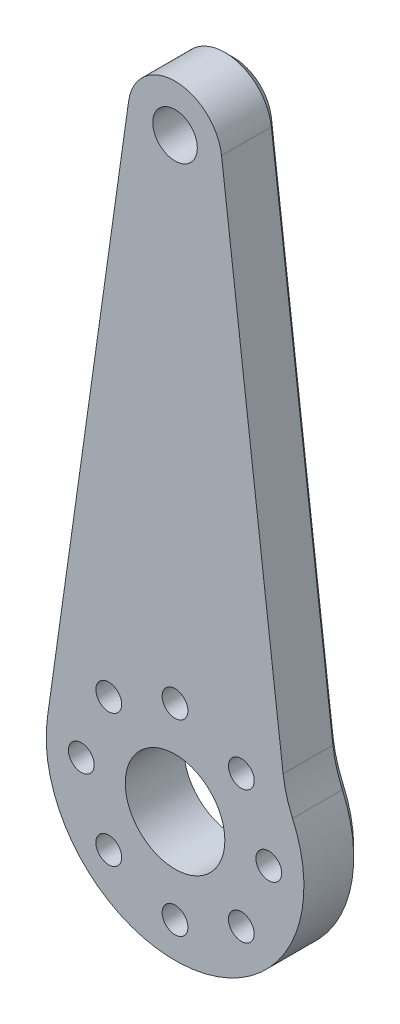
ISO-10303-21;
HEADER;
FILE_DESCRIPTION(('STEP AP214'),'2;1');
FILE_NAME('part.step','',(''),(''),'','','');
FILE_SCHEMA(('AUTOMOTIVE_DESIGN { 1 0 10303 214 1 1 1 1 }'));
ENDSEC;
DATA;
#1=APPLICATION_CONTEXT('core data for automotive mechanical design processes');
#2=APPLICATION_PROTOCOL_DEFINITION('international standard','automotive_design',2000,#1);
#3=PRODUCT_CONTEXT('',#1,'mechanical');
#4=PRODUCT('Part','Part','',(#3));
#5=PRODUCT_RELATED_PRODUCT_CATEGORY('part','',(#4));
#6=PRODUCT_DEFINITION_FORMATION('','',#4);
#7=PRODUCT_DEFINITION_CONTEXT('part definition',#1,'design');
#8=PRODUCT_DEFINITION('design','',#6,#7);
#9=PRODUCT_DEFINITION_SHAPE('','',#8);
#10=(LENGTH_UNIT() NAMED_UNIT(*) SI_UNIT(.MILLI.,.METRE.));
#11=(NAMED_UNIT(*) PLANE_ANGLE_UNIT() SI_UNIT($,.RADIAN.));
#12=(NAMED_UNIT(*) SI_UNIT($,.STERADIAN.) SOLID_ANGLE_UNIT());
#13=UNCERTAINTY_MEASURE_WITH_UNIT(LENGTH_MEASURE(1.E-05),#10,'distance_accuracy_value','');
#14=(GEOMETRIC_REPRESENTATION_CONTEXT(3) GLOBAL_UNCERTAINTY_ASSIGNED_CONTEXT((#13)) GLOBAL_UNIT_ASSIGNED_CONTEXT((#10,
#11,#12)) REPRESENTATION_CONTEXT('',''));
#15=CARTESIAN_POINT('',(0.,0.,0.));
#16=DIRECTION('',(0.,0.,1.));
#17=DIRECTION('',(1.,0.,0.));
#18=AXIS2_PLACEMENT_3D('',#15,#16,#17);
#19=CARTESIAN_POINT('',(-7.04977781571719,-19.9639036018759,5.));
#20=DIRECTION('',(0.,0.,-1.));
#21=DIRECTION('',(-1.,0.,0.));
#22=AXIS2_PLACEMENT_3D('',#19,#20,#21);
#23=CYLINDRICAL_SURFACE('',#22,1.1);
#24=CARTESIAN_POINT('',(-7.04977781571719,-19.9639036018759,5.));
#25=DIRECTION('',(0.,0.,1.));
#26=DIRECTION('',(1.,0.,0.));
#27=AXIS2_PLACEMENT_3D('',#24,#25,#26);
#28=CIRCLE('',#27,1.1);
#29=CARTESIAN_POINT('',(-5.94977781571719,-19.9639036018759,5.));
#30=VERTEX_POINT('',#29);
#31=EDGE_CURVE('E196',#30,#30,#28,.T.);
#32=ORIENTED_EDGE('',*,*,#31,.T.);
#33=EDGE_LOOP('',(#32));
#34=FACE_BOUND('',#33,.T.);
#35=CARTESIAN_POINT('',(-7.04977781571719,-19.9639036018759,2.25));
#36=DIRECTION('',(0.,0.,-1.));
#37=DIRECTION('',(-1.,0.,0.));
#38=AXIS2_PLACEMENT_3D('',#35,#36,#37);
#39=CIRCLE('',#38,1.1);
#40=CARTESIAN_POINT('',(-8.14977781571719,-19.9639036018759,2.25));
#41=VERTEX_POINT('',#40);
#42=EDGE_CURVE('E178',#41,#41,#39,.T.);
#43=ORIENTED_EDGE('',*,*,#42,.T.);
#44=EDGE_LOOP('',(#43));
#45=FACE_BOUND('',#44,.T.);
#46=ADVANCED_FACE('F35',(#34,#45),#23,.F.);
#47=CARTESIAN_POINT('',(-9.39292356622481,-25.6207578513683,5.));
#48=DIRECTION('',(0.,0.,-1.));
#49=DIRECTION('',(-1.,0.,0.));
#50=AXIS2_PLACEMENT_3D('',#47,#48,#49);
#51=CYLINDRICAL_SURFACE('',#50,1.1);
#52=CARTESIAN_POINT('',(-9.39292356622481,-25.6207578513683,5.));
#53=DIRECTION('',(0.,0.,1.));
#54=DIRECTION('',(1.,0.,0.));
#55=AXIS2_PLACEMENT_3D('',#52,#53,#54);
#56=CIRCLE('',#55,1.1);
#57=CARTESIAN_POINT('',(-8.29292356622481,-25.6207578513683,5.));
#58=VERTEX_POINT('',#57);
#59=EDGE_CURVE('E193',#58,#58,#56,.T.);
#60=ORIENTED_EDGE('',*,*,#59,.T.);
#61=EDGE_LOOP('',(#60));
#62=FACE_BOUND('',#61,.T.);
#63=CARTESIAN_POINT('',(-9.39292356622481,-25.6207578513683,2.25));
#64=DIRECTION('',(0.,0.,-1.));
#65=DIRECTION('',(-1.,0.,0.));
#66=AXIS2_PLACEMENT_3D('',#63,#64,#65);
#67=CIRCLE('',#66,1.1);
#68=CARTESIAN_POINT('',(-10.4929235662248,-25.6207578513683,2.25));
#69=VERTEX_POINT('',#68);
#70=EDGE_CURVE('E234',#69,#69,#67,.T.);
#71=ORIENTED_EDGE('',*,*,#70,.T.);
#72=EDGE_LOOP('',(#71));
#73=FACE_BOUND('',#72,.T.);
#74=ADVANCED_FACE('F337',(#62,#73),#51,.F.);
#75=CARTESIAN_POINT('',(-15.0497778157172,-27.9639036018759,5.));
#76=DIRECTION('',(0.,0.,-1.));
#77=DIRECTION('',(-1.,0.,0.));
#78=AXIS2_PLACEMENT_3D('',#75,#76,#77);
#79=CYLINDRICAL_SURFACE('',#78,1.1);
#80=CARTESIAN_POINT('',(-15.0497778157172,-27.9639036018759,5.));
#81=DIRECTION('',(0.,0.,1.));
#82=DIRECTION('',(1.,0.,0.));
#83=AXIS2_PLACEMENT_3D('',#80,#81,#82);
#84=CIRCLE('',#83,1.1);
#85=CARTESIAN_POINT('',(-13.9497778157172,-27.9639036018759,5.));
#86=VERTEX_POINT('',#85);
#87=EDGE_CURVE('E190',#86,#86,#84,.T.);
#88=ORIENTED_EDGE('',*,*,#87,.T.);
#89=EDGE_LOOP('',(#88));
#90=FACE_BOUND('',#89,.T.);
#91=CARTESIAN_POINT('',(-15.0497778157172,-27.9639036018759,2.25));
#92=DIRECTION('',(0.,0.,-1.));
#93=DIRECTION('',(-1.,0.,0.));
#94=AXIS2_PLACEMENT_3D('',#91,#92,#93);
#95=CIRCLE('',#94,1.1);
#96=CARTESIAN_POINT('',(-16.1497778157172,-27.9639036018759,2.25));
#97=VERTEX_POINT('',#96);
#98=EDGE_CURVE('E231',#97,#97,#95,.T.);
#99=ORIENTED_EDGE('',*,*,#98,.T.);
#100=EDGE_LOOP('',(#99));
#101=FACE_BOUND('',#100,.T.);
#102=ADVANCED_FACE('F342',(#90,#101),#79,.F.);
#103=CARTESIAN_POINT('',(-20.7066320652096,-25.6207578513683,5.));
#104=DIRECTION('',(0.,0.,-1.));
#105=DIRECTION('',(-1.,0.,0.));
#106=AXIS2_PLACEMENT_3D('',#103,#104,#105);
#107=CYLINDRICAL_SURFACE('',#106,1.1);
#108=CARTESIAN_POINT('',(-20.7066320652096,-25.6207578513683,5.));
#109=DIRECTION('',(0.,0.,1.));
#110=DIRECTION('',(1.,0.,0.));
#111=AXIS2_PLACEMENT_3D('',#108,#109,#110);
#112=CIRCLE('',#111,1.1);
#113=CARTESIAN_POINT('',(-19.6066320652096,-25.6207578513683,5.));
#114=VERTEX_POINT('',#113);
#115=EDGE_CURVE('E187',#114,#114,#112,.T.);
#116=ORIENTED_EDGE('',*,*,#115,.T.);
#117=EDGE_LOOP('',(#116));
#118=FACE_BOUND('',#117,.T.);
#119=CARTESIAN_POINT('',(-20.7066320652096,-25.6207578513683,2.25));
#120=DIRECTION('',(0.,0.,-1.));
#121=DIRECTION('',(-1.,0.,0.));
#122=AXIS2_PLACEMENT_3D('',#119,#120,#121);
#123=CIRCLE('',#122,1.1);
#124=CARTESIAN_POINT('',(-21.8066320652096,-25.6207578513683,2.25));
#125=VERTEX_POINT('',#124);
#126=EDGE_CURVE('E228',#125,#125,#123,.T.);
#127=ORIENTED_EDGE('',*,*,#126,.T.);
#128=EDGE_LOOP('',(#127));
#129=FACE_BOUND('',#128,.T.);
#130=ADVANCED_FACE('F349',(#118,#129),#107,.F.);
#131=CARTESIAN_POINT('',(-23.0497778157172,-19.9639036018759,5.));
#132=DIRECTION('',(0.,0.,-1.));
#133=DIRECTION('',(-1.,0.,0.));
#134=AXIS2_PLACEMENT_3D('',#131,#132,#133);
#135=CYLINDRICAL_SURFACE('',#134,1.1);
#136=CARTESIAN_POINT('',(-23.0497778157172,-19.9639036018759,5.));
#137=DIRECTION('',(0.,0.,1.));
#138=DIRECTION('',(1.,0.,0.));
#139=AXIS2_PLACEMENT_3D('',#136,#137,#138);
#140=CIRCLE('',#139,1.1);
#141=CARTESIAN_POINT('',(-21.9497778157172,-19.9639036018759,5.));
#142=VERTEX_POINT('',#141);
#143=EDGE_CURVE('E184',#142,#142,#140,.T.);
#144=ORIENTED_EDGE('',*,*,#143,.T.);
#145=EDGE_LOOP('',(#144));
#146=FACE_BOUND('',#145,.T.);
#147=CARTESIAN_POINT('',(-23.0497778157172,-19.9639036018759,2.25));
#148=DIRECTION('',(0.,0.,-1.));
#149=DIRECTION('',(-1.,0.,0.));
#150=AXIS2_PLACEMENT_3D('',#147,#148,#149);
#151=CIRCLE('',#150,1.1);
#152=CARTESIAN_POINT('',(-24.1497778157172,-19.9639036018759,2.25));
#153=VERTEX_POINT('',#152);
#154=EDGE_CURVE('E225',#153,#153,#151,.T.);
#155=ORIENTED_EDGE('',*,*,#154,.T.);
#156=EDGE_LOOP('',(#155));
#157=FACE_BOUND('',#156,.T.);
#158=ADVANCED_FACE('F353',(#146,#157),#135,.F.);
#159=CARTESIAN_POINT('',(-20.7066320652096,-14.3070493523836,5.));
#160=DIRECTION('',(0.,0.,-1.));
#161=DIRECTION('',(-1.,0.,0.));
#162=AXIS2_PLACEMENT_3D('',#159,#160,#161);
#163=CYLINDRICAL_SURFACE('',#162,1.1);
#164=CARTESIAN_POINT('',(-20.7066320652096,-14.3070493523836,5.));
#165=DIRECTION('',(0.,0.,1.));
#166=DIRECTION('',(1.,0.,0.));
#167=AXIS2_PLACEMENT_3D('',#164,#165,#166);
#168=CIRCLE('',#167,1.1);
#169=CARTESIAN_POINT('',(-19.6066320652096,-14.3070493523836,5.));
#170=VERTEX_POINT('',#169);
#171=EDGE_CURVE('E181',#170,#170,#168,.T.);
#172=ORIENTED_EDGE('',*,*,#171,.T.);
#173=EDGE_LOOP('',(#172));
#174=FACE_BOUND('',#173,.T.);
#175=CARTESIAN_POINT('',(-20.7066320652096,-14.3070493523836,2.25));
#176=DIRECTION('',(0.,0.,-1.));
#177=DIRECTION('',(-1.,0.,0.));
#178=AXIS2_PLACEMENT_3D('',#175,#176,#177);
#179=CIRCLE('',#178,1.1);
#180=CARTESIAN_POINT('',(-21.8066320652096,-14.3070493523836,2.25));
#181=VERTEX_POINT('',#180);
#182=EDGE_CURVE('E222',#181,#181,#179,.T.);
#183=ORIENTED_EDGE('',*,*,#182,.T.);
#184=EDGE_LOOP('',(#183));
#185=FACE_BOUND('',#184,.T.);
#186=ADVANCED_FACE('F357',(#174,#185),#163,.F.);
#187=CARTESIAN_POINT('',(-15.0497778157172,-11.9639036018759,5.));
#188=DIRECTION('',(0.,0.,-1.));
#189=DIRECTION('',(-1.,0.,0.));
#190=AXIS2_PLACEMENT_3D('',#187,#188,#189);
#191=CYLINDRICAL_SURFACE('',#190,1.1);
#192=CARTESIAN_POINT('',(-15.0497778157172,-11.9639036018759,5.));
#193=DIRECTION('',(0.,0.,1.));
#194=DIRECTION('',(1.,0.,0.));
#195=AXIS2_PLACEMENT_3D('',#192,#193,#194);
#196=CIRCLE('',#195,1.1);
#197=CARTESIAN_POINT('',(-13.9497778157172,-11.9639036018759,5.));
#198=VERTEX_POINT('',#197);
#199=EDGE_CURVE('E177',#198,#198,#196,.T.);
#200=ORIENTED_EDGE('',*,*,#199,.T.);
#201=EDGE_LOOP('',(#200));
#202=FACE_BOUND('',#201,.T.);
#203=CARTESIAN_POINT('',(-15.0497778157172,-11.9639036018759,2.25));
#204=DIRECTION('',(0.,0.,-1.));
#205=DIRECTION('',(-1.,0.,0.));
#206=AXIS2_PLACEMENT_3D('',#203,#204,#205);
#207=CIRCLE('',#206,1.1);
#208=CARTESIAN_POINT('',(-16.1497778157172,-11.9639036018759,2.25));
#209=VERTEX_POINT('',#208);
#210=EDGE_CURVE('E219',#209,#209,#207,.T.);
#211=ORIENTED_EDGE('',*,*,#210,.T.);
#212=EDGE_LOOP('',(#211));
#213=FACE_BOUND('',#212,.T.);
#214=ADVANCED_FACE('F361',(#202,#213),#191,.F.);
#215=CARTESIAN_POINT('',(-9.39292356622481,-14.3070493523836,5.));
#216=DIRECTION('',(0.,0.,-1.));
#217=DIRECTION('',(-1.,0.,0.));
#218=AXIS2_PLACEMENT_3D('',#215,#216,#217);
#219=CYLINDRICAL_SURFACE('',#218,1.1);
#220=CARTESIAN_POINT('',(-9.39292356622481,-14.3070493523836,5.));
#221=DIRECTION('',(0.,0.,1.));
#222=DIRECTION('',(1.,0.,0.));
#223=AXIS2_PLACEMENT_3D('',#220,#221,#222);
#224=CIRCLE('',#223,1.1);
#225=CARTESIAN_POINT('',(-8.29292356622481,-14.3070493523836,5.));
#226=VERTEX_POINT('',#225);
#227=EDGE_CURVE('E174',#226,#226,#224,.T.);
#228=ORIENTED_EDGE('',*,*,#227,.T.);
#229=EDGE_LOOP('',(#228));
#230=FACE_BOUND('',#229,.T.);
#231=CARTESIAN_POINT('',(-9.39292356622481,-14.3070493523836,2.25));
#232=DIRECTION('',(0.,0.,-1.));
#233=DIRECTION('',(-1.,0.,0.));
#234=AXIS2_PLACEMENT_3D('',#231,#232,#233);
#235=CIRCLE('',#234,1.1);
#236=CARTESIAN_POINT('',(-10.4929235662248,-14.3070493523836,2.25));
#237=VERTEX_POINT('',#236);
#238=EDGE_CURVE('E171',#237,#237,#235,.T.);
#239=ORIENTED_EDGE('',*,*,#238,.T.);
#240=EDGE_LOOP('',(#239));
#241=FACE_BOUND('',#240,.T.);
#242=ADVANCED_FACE('F365',(#230,#241),#219,.F.);
#243=CARTESIAN_POINT('',(-15.0497778157172,30.0360963981241,5.));
#244=DIRECTION('',(0.,0.,1.));
#245=DIRECTION('',(1.,0.,0.));
#246=AXIS2_PLACEMENT_3D('',#243,#244,#245);
#247=PLANE('',#246);
#248=DIRECTION('',(0.121040450977477,-0.992647575540871,0.));
#249=VECTOR('',#248,1.);
#250=CARTESIAN_POINT('',(-11.0791875135537,30.520258202034,5.));
#251=LINE('',#250,#249);
#252=CARTESIAN_POINT('',(-11.0791875135537,30.520258202034,5.));
#253=VERTEX_POINT('',#252);
#254=CARTESIAN_POINT('',(-5.8267486952866,-12.5547685061841,5.));
#255=VERTEX_POINT('',#254);
#256=EDGE_CURVE('E113',#253,#255,#251,.T.);
#257=ORIENTED_EDGE('',*,*,#256,.F.);
#258=CARTESIAN_POINT('',(-15.0497778157172,30.0360963981241,5.));
#259=DIRECTION('',(0.,0.,1.));
#260=DIRECTION('',(1.,0.,0.));
#261=AXIS2_PLACEMENT_3D('',#258,#259,#260);
#262=CIRCLE('',#261,4.);
#263=CARTESIAN_POINT('',(-19.0103838299529,30.5960963981241,5.));
#264=VERTEX_POINT('',#263);
#265=EDGE_CURVE('E98',#253,#264,#262,.T.);
#266=ORIENTED_EDGE('',*,*,#265,.T.);
#267=DIRECTION('',(-0.14,-0.990151503558925,0.));
#268=VECTOR('',#267,1.);
#269=CARTESIAN_POINT('',(-19.0103838299529,30.5960963981241,5.));
#270=LINE('',#269,#268);
#271=CARTESIAN_POINT('',(-25.9414443548654,-18.4239036018759,5.));
#272=VERTEX_POINT('',#271);
#273=EDGE_CURVE('E105',#264,#272,#270,.T.);
#274=ORIENTED_EDGE('',*,*,#273,.T.);
#275=CARTESIAN_POINT('',(-15.0497778157172,-19.9639036018759,5.));
#276=DIRECTION('',(0.,0.,1.));
#277=DIRECTION('',(1.,0.,0.));
#278=AXIS2_PLACEMENT_3D('',#275,#276,#277);
#279=CIRCLE('',#278,11.);
#280=CARTESIAN_POINT('',(-5.01908478551565,-15.4489066656792,5.));
#281=VERTEX_POINT('',#280);
#282=EDGE_CURVE('E211',#272,#281,#279,.T.);
#283=ORIENTED_EDGE('',*,*,#282,.T.);
#284=CARTESIAN_POINT('',(4.09972706012211,-11.3443639964094,5.));
#285=DIRECTION('',(0.,0.,1.));
#286=DIRECTION('',(1.,0.,0.));
#287=AXIS2_PLACEMENT_3D('',#284,#285,#286);
#288=CIRCLE('',#287,10.);
#289=EDGE_CURVE('E122',#281,#255,#288,.F.);
#290=ORIENTED_EDGE('',*,*,#289,.T.);
#291=EDGE_LOOP('',(#257,#266,#274,#283,#290));
#292=FACE_BOUND('',#291,.T.);
#293=ORIENTED_EDGE('',*,*,#199,.F.);
#294=EDGE_LOOP('',(#293));
#295=FACE_BOUND('',#294,.T.);
#296=ORIENTED_EDGE('',*,*,#143,.F.);
#297=EDGE_LOOP('',(#296));
#298=FACE_BOUND('',#297,.T.);
#299=ORIENTED_EDGE('',*,*,#87,.F.);
#300=EDGE_LOOP('',(#299));
#301=FACE_BOUND('',#300,.T.);
#302=ORIENTED_EDGE('',*,*,#31,.F.);
#303=EDGE_LOOP('',(#302));
#304=FACE_BOUND('',#303,.T.);
#305=CARTESIAN_POINT('',(-15.0497778157172,30.0360963981241,5.));
#306=DIRECTION('',(0.,0.,1.));
#307=DIRECTION('',(1.,0.,0.));
#308=AXIS2_PLACEMENT_3D('',#305,#306,#307);
#309=CIRCLE('',#308,1.9);
#310=CARTESIAN_POINT('',(-13.1497778157172,30.0360963981241,5.));
#311=VERTEX_POINT('',#310);
#312=EDGE_CURVE('E106',#311,#311,#309,.T.);
#313=ORIENTED_EDGE('',*,*,#312,.F.);
#314=EDGE_LOOP('',(#313));
#315=FACE_BOUND('',#314,.T.);
#316=CARTESIAN_POINT('',(-15.0497778157172,-19.9639036018759,5.));
#317=DIRECTION('',(0.,0.,1.));
#318=DIRECTION('',(1.,0.,0.));
#319=AXIS2_PLACEMENT_3D('',#316,#317,#318);
#320=CIRCLE('',#319,4.25);
#321=CARTESIAN_POINT('',(-10.7997778157172,-19.9639036018759,5.));
#322=VERTEX_POINT('',#321);
#323=EDGE_CURVE('E200',#322,#322,#320,.T.);
#324=ORIENTED_EDGE('',*,*,#323,.F.);
#325=EDGE_LOOP('',(#324));
#326=FACE_BOUND('',#325,.T.);
#327=ORIENTED_EDGE('',*,*,#59,.F.);
#328=EDGE_LOOP('',(#327));
#329=FACE_BOUND('',#328,.T.);
#330=ORIENTED_EDGE('',*,*,#115,.F.);
#331=EDGE_LOOP('',(#330));
#332=FACE_BOUND('',#331,.T.);
#333=ORIENTED_EDGE('',*,*,#171,.F.);
#334=EDGE_LOOP('',(#333));
#335=FACE_BOUND('',#334,.T.);
#336=ORIENTED_EDGE('',*,*,#227,.F.);
#337=EDGE_LOOP('',(#336));
#338=FACE_BOUND('',#337,.T.);
#339=ADVANCED_FACE('F118',(#292,#295,#298,#301,#304,#315,#326,#329,#332,#335,#338),#247,.T.);
#340=CARTESIAN_POINT('',(-15.0497778157172,30.0360963981241,0.));
#341=DIRECTION('',(0.,0.,1.));
#342=DIRECTION('',(1.,0.,0.));
#343=AXIS2_PLACEMENT_3D('',#340,#341,#342);
#344=PLANE('',#343);
#345=CARTESIAN_POINT('',(-15.0497778157172,30.0360963981241,0.));
#346=DIRECTION('',(0.,0.,1.));
#347=DIRECTION('',(1.,0.,0.));
#348=AXIS2_PLACEMENT_3D('',#345,#346,#347);
#349=CIRCLE('',#348,3.25);
#350=CARTESIAN_POINT('',(-18.2677702022837,30.4910963981241,0.));
#351=VERTEX_POINT('',#350);
#352=CARTESIAN_POINT('',(-11.8236731952094,30.4294778638009,0.));
#353=VERTEX_POINT('',#352);
#354=EDGE_CURVE('E248',#351,#353,#349,.F.);
#355=ORIENTED_EDGE('',*,*,#354,.T.);
#356=DIRECTION('',(0.121040450977477,-0.992647575540871,0.));
#357=VECTOR('',#356,1.);
#358=CARTESIAN_POINT('',(-11.8236731952094,30.4294778638009,0.));
#359=LINE('',#358,#357);
#360=CARTESIAN_POINT('',(-6.57123437694225,-12.6455488444172,0.));
#361=VERTEX_POINT('',#360);
#362=EDGE_CURVE('E252',#353,#361,#359,.T.);
#363=ORIENTED_EDGE('',*,*,#362,.T.);
#364=CARTESIAN_POINT('',(4.09972706012211,-11.3443639964094,0.));
#365=DIRECTION('',(0.,0.,1.));
#366=DIRECTION('',(1.,0.,0.));
#367=AXIS2_PLACEMENT_3D('',#364,#365,#366);
#368=CIRCLE('',#367,10.75);
#369=CARTESIAN_POINT('',(-5.70299567393849,-15.7567473658744,0.));
#370=VERTEX_POINT('',#369);
#371=EDGE_CURVE('E250',#361,#370,#368,.T.);
#372=ORIENTED_EDGE('',*,*,#371,.T.);
#373=CARTESIAN_POINT('',(-15.0497778157172,-19.9639036018759,0.));
#374=DIRECTION('',(0.,0.,1.));
#375=DIRECTION('',(1.,0.,0.));
#376=AXIS2_PLACEMENT_3D('',#373,#374,#375);
#377=CIRCLE('',#376,10.25);
#378=CARTESIAN_POINT('',(-25.1988307271962,-18.5289036018759,0.));
#379=VERTEX_POINT('',#378);
#380=EDGE_CURVE('E246',#370,#379,#377,.F.);
#381=ORIENTED_EDGE('',*,*,#380,.T.);
#382=DIRECTION('',(0.14,0.990151503558925,0.));
#383=VECTOR('',#382,1.);
#384=CARTESIAN_POINT('',(-18.2677702022837,30.4910963981241,0.));
#385=LINE('',#384,#383);
#386=EDGE_CURVE('E244',#379,#351,#385,.T.);
#387=ORIENTED_EDGE('',*,*,#386,.T.);
#388=EDGE_LOOP('',(#355,#363,#372,#381,#387));
#389=FACE_BOUND('',#388,.T.);
#390=CARTESIAN_POINT('',(-20.7066320652096,-14.3070493523835,0.));
#391=DIRECTION('',(0.,0.,-1.));
#392=DIRECTION('',(-1.,0.,0.));
#393=AXIS2_PLACEMENT_3D('',#390,#391,#392);
#394=CIRCLE('',#393,1.75);
#395=CARTESIAN_POINT('',(-22.4566320652096,-14.3070493523835,0.));
#396=VERTEX_POINT('',#395);
#397=EDGE_CURVE('E123',#396,#396,#394,.T.);
#398=ORIENTED_EDGE('',*,*,#397,.F.);
#399=EDGE_LOOP('',(#398));
#400=FACE_BOUND('',#399,.T.);
#401=CARTESIAN_POINT('',(-15.0497778157172,-11.9639036018759,0.));
#402=DIRECTION('',(0.,0.,-1.));
#403=DIRECTION('',(-1.,0.,0.));
#404=AXIS2_PLACEMENT_3D('',#401,#402,#403);
#405=CIRCLE('',#404,1.75);
#406=CARTESIAN_POINT('',(-16.7997778157172,-11.9639036018759,0.));
#407=VERTEX_POINT('',#406);
#408=EDGE_CURVE('E163',#407,#407,#405,.T.);
#409=ORIENTED_EDGE('',*,*,#408,.F.);
#410=EDGE_LOOP('',(#409));
#411=FACE_BOUND('',#410,.T.);
#412=CARTESIAN_POINT('',(-9.3929235662248,-14.3070493523836,0.));
#413=DIRECTION('',(0.,0.,-1.));
#414=DIRECTION('',(-1.,0.,0.));
#415=AXIS2_PLACEMENT_3D('',#412,#413,#414);
#416=CIRCLE('',#415,1.75);
#417=CARTESIAN_POINT('',(-11.1429235662248,-14.3070493523836,0.));
#418=VERTEX_POINT('',#417);
#419=EDGE_CURVE('E157',#418,#418,#416,.T.);
#420=ORIENTED_EDGE('',*,*,#419,.F.);
#421=EDGE_LOOP('',(#420));
#422=FACE_BOUND('',#421,.T.);
#423=CARTESIAN_POINT('',(-7.04977781571719,-19.9639036018759,0.));
#424=DIRECTION('',(0.,0.,-1.));
#425=DIRECTION('',(-1.,0.,0.));
#426=AXIS2_PLACEMENT_3D('',#423,#424,#425);
#427=CIRCLE('',#426,1.75);
#428=CARTESIAN_POINT('',(-8.79977781571719,-19.9639036018759,0.));
#429=VERTEX_POINT('',#428);
#430=EDGE_CURVE('E151',#429,#429,#427,.T.);
#431=ORIENTED_EDGE('',*,*,#430,.F.);
#432=EDGE_LOOP('',(#431));
#433=FACE_BOUND('',#432,.T.);
#434=CARTESIAN_POINT('',(-9.39292356622481,-25.6207578513683,0.));
#435=DIRECTION('',(0.,0.,-1.));
#436=DIRECTION('',(-1.,0.,0.));
#437=AXIS2_PLACEMENT_3D('',#434,#435,#436);
#438=CIRCLE('',#437,1.75);
#439=CARTESIAN_POINT('',(-11.1429235662248,-25.6207578513683,0.));
#440=VERTEX_POINT('',#439);
#441=EDGE_CURVE('E145',#440,#440,#438,.T.);
#442=ORIENTED_EDGE('',*,*,#441,.F.);
#443=EDGE_LOOP('',(#442));
#444=FACE_BOUND('',#443,.T.);
#445=CARTESIAN_POINT('',(-15.0497778157172,-27.9639036018759,0.));
#446=DIRECTION('',(0.,0.,-1.));
#447=DIRECTION('',(-1.,0.,0.));
#448=AXIS2_PLACEMENT_3D('',#445,#446,#447);
#449=CIRCLE('',#448,1.75);
#450=CARTESIAN_POINT('',(-16.7997778157172,-27.9639036018759,0.));
#451=VERTEX_POINT('',#450);
#452=EDGE_CURVE('E139',#451,#451,#449,.T.);
#453=ORIENTED_EDGE('',*,*,#452,.F.);
#454=EDGE_LOOP('',(#453));
#455=FACE_BOUND('',#454,.T.);
#456=CARTESIAN_POINT('',(-20.7066320652096,-25.6207578513683,0.));
#457=DIRECTION('',(0.,0.,-1.));
#458=DIRECTION('',(-1.,0.,0.));
#459=AXIS2_PLACEMENT_3D('',#456,#457,#458);
#460=CIRCLE('',#459,1.74999999999999);
#461=CARTESIAN_POINT('',(-22.4566320652096,-25.6207578513683,0.));
#462=VERTEX_POINT('',#461);
#463=EDGE_CURVE('E133',#462,#462,#460,.T.);
#464=ORIENTED_EDGE('',*,*,#463,.F.);
#465=EDGE_LOOP('',(#464));
#466=FACE_BOUND('',#465,.T.);
#467=CARTESIAN_POINT('',(-23.0497778157172,-19.9639036018759,0.));
#468=DIRECTION('',(0.,0.,-1.));
#469=DIRECTION('',(-1.,0.,0.));
#470=AXIS2_PLACEMENT_3D('',#467,#468,#469);
#471=CIRCLE('',#470,1.75);
#472=CARTESIAN_POINT('',(-24.7997778157172,-19.9639036018759,0.));
#473=VERTEX_POINT('',#472);
#474=EDGE_CURVE('E132',#473,#473,#471,.T.);
#475=ORIENTED_EDGE('',*,*,#474,.F.);
#476=EDGE_LOOP('',(#475));
#477=FACE_BOUND('',#476,.T.);
#478=CARTESIAN_POINT('',(-15.0497778157172,30.0360963981241,0.));
#479=DIRECTION('',(0.,0.,1.));
#480=DIRECTION('',(1.,0.,0.));
#481=AXIS2_PLACEMENT_3D('',#478,#479,#480);
#482=CIRCLE('',#481,1.9);
#483=CARTESIAN_POINT('',(-13.1497778157172,30.0360963981241,0.));
#484=VERTEX_POINT('',#483);
#485=EDGE_CURVE('E203',#484,#484,#482,.T.);
#486=ORIENTED_EDGE('',*,*,#485,.T.);
#487=EDGE_LOOP('',(#486));
#488=FACE_BOUND('',#487,.T.);
#489=CARTESIAN_POINT('',(-15.0497778157172,-19.9639036018759,0.));
#490=DIRECTION('',(0.,0.,1.));
#491=DIRECTION('',(1.,0.,0.));
#492=AXIS2_PLACEMENT_3D('',#489,#490,#491);
#493=CIRCLE('',#492,4.25);
#494=CARTESIAN_POINT('',(-10.7997778157172,-19.9639036018759,0.));
#495=VERTEX_POINT('',#494);
#496=EDGE_CURVE('E199',#495,#495,#493,.T.);
#497=ORIENTED_EDGE('',*,*,#496,.T.);
#498=EDGE_LOOP('',(#497));
#499=FACE_BOUND('',#498,.T.);
#500=ADVANCED_FACE('F296',(#389,#400,#411,#422,#433,#444,#455,#466,#477,#488,#499),#344,.F.);
#501=CARTESIAN_POINT('',(-15.0497778157172,30.0360963981241,5.));
#502=DIRECTION('',(0.,0.,-1.));
#503=DIRECTION('',(-1.,0.,0.));
#504=AXIS2_PLACEMENT_3D('',#501,#502,#503);
#505=CYLINDRICAL_SURFACE('',#504,4.);
#506=DIRECTION('',(0.,0.,-1.));
#507=VECTOR('',#506,1.);
#508=CARTESIAN_POINT('',(-11.0791875135537,30.520258202034,10.));
#509=LINE('',#508,#507);
#510=CARTESIAN_POINT('',(-11.0791875135537,30.520258202034,0.749999999999994));
#511=VERTEX_POINT('',#510);
#512=EDGE_CURVE('E101',#253,#511,#509,.T.);
#513=ORIENTED_EDGE('',*,*,#512,.T.);
#514=CARTESIAN_POINT('',(-15.0497778157172,30.0360963981241,0.749999999999994));
#515=DIRECTION('',(0.,0.,1.));
#516=DIRECTION('',(1.,0.,0.));
#517=AXIS2_PLACEMENT_3D('',#514,#515,#516);
#518=CIRCLE('',#517,4.);
#519=CARTESIAN_POINT('',(-19.0103838299529,30.5960963981241,0.749999999999995));
#520=VERTEX_POINT('',#519);
#521=EDGE_CURVE('E58',#511,#520,#518,.T.);
#522=ORIENTED_EDGE('',*,*,#521,.T.);
#523=DIRECTION('',(0.,0.,-1.));
#524=VECTOR('',#523,1.);
#525=CARTESIAN_POINT('',(-19.0103838299529,30.5960963981241,5.));
#526=LINE('',#525,#524);
#527=EDGE_CURVE('E102',#264,#520,#526,.T.);
#528=ORIENTED_EDGE('',*,*,#527,.F.);
#529=ORIENTED_EDGE('',*,*,#265,.F.);
#530=EDGE_LOOP('',(#513,#522,#528,#529));
#531=FACE_BOUND('',#530,.T.);
#532=ADVANCED_FACE('F100',(#531),#505,.T.);
#533=CARTESIAN_POINT('',(-19.0103838299529,30.5960963981241,5.));
#534=DIRECTION('',(0.990151503558925,-0.14,0.));
#535=DIRECTION('',(0.14,0.990151503558925,0.));
#536=AXIS2_PLACEMENT_3D('',#533,#534,#535);
#537=PLANE('',#536);
#538=ORIENTED_EDGE('',*,*,#527,.T.);
#539=DIRECTION('',(-0.14,-0.990151503558925,0.));
#540=VECTOR('',#539,1.);
#541=CARTESIAN_POINT('',(-19.0103838299529,30.5960963981241,0.749999999999995));
#542=LINE('',#541,#540);
#543=CARTESIAN_POINT('',(-25.9414443548654,-18.4239036018759,0.749999999999995));
#544=VERTEX_POINT('',#543);
#545=EDGE_CURVE('E11',#520,#544,#542,.T.);
#546=ORIENTED_EDGE('',*,*,#545,.T.);
#547=DIRECTION('',(0.,0.,-1.));
#548=VECTOR('',#547,1.);
#549=CARTESIAN_POINT('',(-25.9414443548654,-18.4239036018759,5.));
#550=LINE('',#549,#548);
#551=EDGE_CURVE('E213',#272,#544,#550,.T.);
#552=ORIENTED_EDGE('',*,*,#551,.F.);
#553=ORIENTED_EDGE('',*,*,#273,.F.);
#554=EDGE_LOOP('',(#538,#546,#552,#553));
#555=FACE_BOUND('',#554,.T.);
#556=ADVANCED_FACE('F491',(#555),#537,.F.);
#557=CARTESIAN_POINT('',(-15.0497778157172,-19.9639036018759,5.));
#558=DIRECTION('',(0.,0.,-1.));
#559=DIRECTION('',(-1.,0.,0.));
#560=AXIS2_PLACEMENT_3D('',#557,#558,#559);
#561=CYLINDRICAL_SURFACE('',#560,11.);
#562=ORIENTED_EDGE('',*,*,#551,.T.);
#563=CARTESIAN_POINT('',(-15.0497778157172,-19.9639036018759,0.749999999999994));
#564=DIRECTION('',(0.,0.,1.));
#565=DIRECTION('',(1.,0.,0.));
#566=AXIS2_PLACEMENT_3D('',#563,#564,#565);
#567=CIRCLE('',#566,11.);
#568=CARTESIAN_POINT('',(-5.01908478551565,-15.4489066656792,0.749999999999994));
#569=VERTEX_POINT('',#568);
#570=EDGE_CURVE('E44',#544,#569,#567,.T.);
#571=ORIENTED_EDGE('',*,*,#570,.T.);
#572=DIRECTION('',(0.,0.,-1.));
#573=VECTOR('',#572,1.);
#574=CARTESIAN_POINT('',(-5.01908478551565,-15.4489066656792,5.));
#575=LINE('',#574,#573);
#576=EDGE_CURVE('E240',#569,#281,#575,.F.);
#577=ORIENTED_EDGE('',*,*,#576,.T.);
#578=ORIENTED_EDGE('',*,*,#282,.F.);
#579=EDGE_LOOP('',(#562,#571,#577,#578));
#580=FACE_BOUND('',#579,.T.);
#581=ADVANCED_FACE('F282',(#580),#561,.T.);
#582=CARTESIAN_POINT('',(-15.0497778157172,30.0360963981241,5.));
#583=DIRECTION('',(0.,0.,-1.));
#584=DIRECTION('',(-1.,0.,0.));
#585=AXIS2_PLACEMENT_3D('',#582,#583,#584);
#586=CYLINDRICAL_SURFACE('',#585,1.9);
#587=ORIENTED_EDGE('',*,*,#312,.T.);
#588=EDGE_LOOP('',(#587));
#589=FACE_BOUND('',#588,.T.);
#590=ORIENTED_EDGE('',*,*,#485,.F.);
#591=EDGE_LOOP('',(#590));
#592=FACE_BOUND('',#591,.T.);
#593=ADVANCED_FACE('F323',(#589,#592),#586,.F.);
#594=CARTESIAN_POINT('',(-15.0497778157172,-19.9639036018759,5.));
#595=DIRECTION('',(0.,0.,-1.));
#596=DIRECTION('',(-1.,0.,0.));
#597=AXIS2_PLACEMENT_3D('',#594,#595,#596);
#598=CYLINDRICAL_SURFACE('',#597,4.25);
#599=ORIENTED_EDGE('',*,*,#323,.T.);
#600=EDGE_LOOP('',(#599));
#601=FACE_BOUND('',#600,.T.);
#602=ORIENTED_EDGE('',*,*,#496,.F.);
#603=EDGE_LOOP('',(#602));
#604=FACE_BOUND('',#603,.T.);
#605=ADVANCED_FACE('F320',(#601,#604),#598,.F.);
#606=CARTESIAN_POINT('',(-9.3929235662248,-14.3070493523836,2.25));
#607=DIRECTION('',(0.,0.,-1.));
#608=DIRECTION('',(-1.,0.,0.));
#609=AXIS2_PLACEMENT_3D('',#606,#607,#608);
#610=CYLINDRICAL_SURFACE('',#609,1.75);
#611=CARTESIAN_POINT('',(-9.3929235662248,-14.3070493523836,2.25));
#612=DIRECTION('',(0.,0.,-1.));
#613=DIRECTION('',(-1.,0.,0.));
#614=AXIS2_PLACEMENT_3D('',#611,#612,#613);
#615=CIRCLE('',#614,1.75);
#616=CARTESIAN_POINT('',(-11.1429235662248,-14.3070493523836,2.25));
#617=VERTEX_POINT('',#616);
#618=EDGE_CURVE('E154',#617,#617,#615,.T.);
#619=ORIENTED_EDGE('',*,*,#618,.F.);
#620=EDGE_LOOP('',(#619));
#621=FACE_BOUND('',#620,.T.);
#622=ORIENTED_EDGE('',*,*,#419,.T.);
#623=EDGE_LOOP('',(#622));
#624=FACE_BOUND('',#623,.T.);
#625=ADVANCED_FACE('F322',(#621,#624),#610,.F.);
#626=CARTESIAN_POINT('',(-9.3929235662248,-14.3070493523836,2.25));
#627=DIRECTION('',(0.,0.,-1.));
#628=DIRECTION('',(-1.,0.,0.));
#629=AXIS2_PLACEMENT_3D('',#626,#627,#628);
#630=PLANE('',#629);
#631=ORIENTED_EDGE('',*,*,#238,.F.);
#632=EDGE_LOOP('',(#631));
#633=FACE_BOUND('',#632,.T.);
#634=ORIENTED_EDGE('',*,*,#618,.T.);
#635=EDGE_LOOP('',(#634));
#636=FACE_BOUND('',#635,.T.);
#637=ADVANCED_FACE('F330',(#633,#636),#630,.T.);
#638=CARTESIAN_POINT('',(-15.0497778157172,-11.9639036018759,2.25));
#639=DIRECTION('',(0.,0.,-1.));
#640=DIRECTION('',(-1.,0.,0.));
#641=AXIS2_PLACEMENT_3D('',#638,#639,#640);
#642=CYLINDRICAL_SURFACE('',#641,1.75);
#643=CARTESIAN_POINT('',(-15.0497778157172,-11.9639036018759,2.25));
#644=DIRECTION('',(0.,0.,-1.));
#645=DIRECTION('',(-1.,0.,0.));
#646=AXIS2_PLACEMENT_3D('',#643,#644,#645);
#647=CIRCLE('',#646,1.75);
#648=CARTESIAN_POINT('',(-16.7997778157172,-11.9639036018759,2.25));
#649=VERTEX_POINT('',#648);
#650=EDGE_CURVE('E160',#649,#649,#647,.T.);
#651=ORIENTED_EDGE('',*,*,#650,.F.);
#652=EDGE_LOOP('',(#651));
#653=FACE_BOUND('',#652,.T.);
#654=ORIENTED_EDGE('',*,*,#408,.T.);
#655=EDGE_LOOP('',(#654));
#656=FACE_BOUND('',#655,.T.);
#657=ADVANCED_FACE('F388',(#653,#656),#642,.F.);
#658=CARTESIAN_POINT('',(-15.0497778157172,-11.9639036018759,2.25));
#659=DIRECTION('',(0.,0.,-1.));
#660=DIRECTION('',(-1.,0.,0.));
#661=AXIS2_PLACEMENT_3D('',#658,#659,#660);
#662=PLANE('',#661);
#663=ORIENTED_EDGE('',*,*,#210,.F.);
#664=EDGE_LOOP('',(#663));
#665=FACE_BOUND('',#664,.T.);
#666=ORIENTED_EDGE('',*,*,#650,.T.);
#667=EDGE_LOOP('',(#666));
#668=FACE_BOUND('',#667,.T.);
#669=ADVANCED_FACE('F383',(#665,#668),#662,.T.);
#670=CARTESIAN_POINT('',(-20.7066320652096,-14.3070493523835,2.25));
#671=DIRECTION('',(0.,0.,-1.));
#672=DIRECTION('',(-1.,0.,0.));
#673=AXIS2_PLACEMENT_3D('',#670,#671,#672);
#674=CYLINDRICAL_SURFACE('',#673,1.75);
#675=CARTESIAN_POINT('',(-20.7066320652096,-14.3070493523835,2.25));
#676=DIRECTION('',(0.,0.,-1.));
#677=DIRECTION('',(-1.,0.,0.));
#678=AXIS2_PLACEMENT_3D('',#675,#676,#677);
#679=CIRCLE('',#678,1.75);
#680=CARTESIAN_POINT('',(-22.4566320652096,-14.3070493523835,2.25));
#681=VERTEX_POINT('',#680);
#682=EDGE_CURVE('E126',#681,#681,#679,.T.);
#683=ORIENTED_EDGE('',*,*,#682,.F.);
#684=EDGE_LOOP('',(#683));
#685=FACE_BOUND('',#684,.T.);
#686=ORIENTED_EDGE('',*,*,#397,.T.);
#687=EDGE_LOOP('',(#686));
#688=FACE_BOUND('',#687,.T.);
#689=ADVANCED_FACE('F380',(#685,#688),#674,.F.);
#690=CARTESIAN_POINT('',(-20.7066320652096,-14.3070493523835,2.25));
#691=DIRECTION('',(0.,0.,-1.));
#692=DIRECTION('',(-1.,0.,0.));
#693=AXIS2_PLACEMENT_3D('',#690,#691,#692);
#694=PLANE('',#693);
#695=ORIENTED_EDGE('',*,*,#182,.F.);
#696=EDGE_LOOP('',(#695));
#697=FACE_BOUND('',#696,.T.);
#698=ORIENTED_EDGE('',*,*,#682,.T.);
#699=EDGE_LOOP('',(#698));
#700=FACE_BOUND('',#699,.T.);
#701=ADVANCED_FACE('F374',(#697,#700),#694,.T.);
#702=CARTESIAN_POINT('',(-23.0497778157172,-19.9639036018759,2.25));
#703=DIRECTION('',(0.,0.,-1.));
#704=DIRECTION('',(-1.,0.,0.));
#705=AXIS2_PLACEMENT_3D('',#702,#703,#704);
#706=CYLINDRICAL_SURFACE('',#705,1.75);
#707=CARTESIAN_POINT('',(-23.0497778157172,-19.9639036018759,2.25));
#708=DIRECTION('',(0.,0.,-1.));
#709=DIRECTION('',(-1.,0.,0.));
#710=AXIS2_PLACEMENT_3D('',#707,#708,#709);
#711=CIRCLE('',#710,1.75);
#712=CARTESIAN_POINT('',(-24.7997778157172,-19.9639036018759,2.25));
#713=VERTEX_POINT('',#712);
#714=EDGE_CURVE('E168',#713,#713,#711,.T.);
#715=ORIENTED_EDGE('',*,*,#714,.F.);
#716=EDGE_LOOP('',(#715));
#717=FACE_BOUND('',#716,.T.);
#718=ORIENTED_EDGE('',*,*,#474,.T.);
#719=EDGE_LOOP('',(#718));
#720=FACE_BOUND('',#719,.T.);
#721=ADVANCED_FACE('F370',(#717,#720),#706,.F.);
#722=CARTESIAN_POINT('',(-23.0497778157172,-19.9639036018759,2.25));
#723=DIRECTION('',(0.,0.,-1.));
#724=DIRECTION('',(-1.,0.,0.));
#725=AXIS2_PLACEMENT_3D('',#722,#723,#724);
#726=PLANE('',#725);
#727=ORIENTED_EDGE('',*,*,#154,.F.);
#728=EDGE_LOOP('',(#727));
#729=FACE_BOUND('',#728,.T.);
#730=ORIENTED_EDGE('',*,*,#714,.T.);
#731=EDGE_LOOP('',(#730));
#732=FACE_BOUND('',#731,.T.);
#733=ADVANCED_FACE('F373',(#729,#732),#726,.T.);
#734=CARTESIAN_POINT('',(-20.7066320652096,-25.6207578513683,2.25));
#735=DIRECTION('',(0.,0.,-1.));
#736=DIRECTION('',(-1.,0.,0.));
#737=AXIS2_PLACEMENT_3D('',#734,#735,#736);
#738=CYLINDRICAL_SURFACE('',#737,1.74999999999999);
#739=CARTESIAN_POINT('',(-20.7066320652096,-25.6207578513683,2.25));
#740=DIRECTION('',(0.,0.,-1.));
#741=DIRECTION('',(-1.,0.,0.));
#742=AXIS2_PLACEMENT_3D('',#739,#740,#741);
#743=CIRCLE('',#742,1.74999999999999);
#744=CARTESIAN_POINT('',(-22.4566320652096,-25.6207578513683,2.25));
#745=VERTEX_POINT('',#744);
#746=EDGE_CURVE('E129',#745,#745,#743,.T.);
#747=ORIENTED_EDGE('',*,*,#746,.F.);
#748=EDGE_LOOP('',(#747));
#749=FACE_BOUND('',#748,.T.);
#750=ORIENTED_EDGE('',*,*,#463,.T.);
#751=EDGE_LOOP('',(#750));
#752=FACE_BOUND('',#751,.T.);
#753=ADVANCED_FACE('F378',(#749,#752),#738,.F.);
#754=CARTESIAN_POINT('',(-20.7066320652096,-25.6207578513683,2.25));
#755=DIRECTION('',(0.,0.,-1.));
#756=DIRECTION('',(-1.,0.,0.));
#757=AXIS2_PLACEMENT_3D('',#754,#755,#756);
#758=PLANE('',#757);
#759=ORIENTED_EDGE('',*,*,#126,.F.);
#760=EDGE_LOOP('',(#759));
#761=FACE_BOUND('',#760,.T.);
#762=ORIENTED_EDGE('',*,*,#746,.T.);
#763=EDGE_LOOP('',(#762));
#764=FACE_BOUND('',#763,.T.);
#765=ADVANCED_FACE('F418',(#761,#764),#758,.T.);
#766=CARTESIAN_POINT('',(-15.0497778157172,-27.9639036018759,2.25));
#767=DIRECTION('',(0.,0.,-1.));
#768=DIRECTION('',(-1.,0.,0.));
#769=AXIS2_PLACEMENT_3D('',#766,#767,#768);
#770=CYLINDRICAL_SURFACE('',#769,1.75);
#771=CARTESIAN_POINT('',(-15.0497778157172,-27.9639036018759,2.25));
#772=DIRECTION('',(0.,0.,-1.));
#773=DIRECTION('',(-1.,0.,0.));
#774=AXIS2_PLACEMENT_3D('',#771,#772,#773);
#775=CIRCLE('',#774,1.75);
#776=CARTESIAN_POINT('',(-16.7997778157172,-27.9639036018759,2.25));
#777=VERTEX_POINT('',#776);
#778=EDGE_CURVE('E136',#777,#777,#775,.T.);
#779=ORIENTED_EDGE('',*,*,#778,.F.);
#780=EDGE_LOOP('',(#779));
#781=FACE_BOUND('',#780,.T.);
#782=ORIENTED_EDGE('',*,*,#452,.T.);
#783=EDGE_LOOP('',(#782));
#784=FACE_BOUND('',#783,.T.);
#785=ADVANCED_FACE('F415',(#781,#784),#770,.F.);
#786=CARTESIAN_POINT('',(-15.0497778157172,-27.9639036018759,2.25));
#787=DIRECTION('',(0.,0.,-1.));
#788=DIRECTION('',(-1.,0.,0.));
#789=AXIS2_PLACEMENT_3D('',#786,#787,#788);
#790=PLANE('',#789);
#791=ORIENTED_EDGE('',*,*,#98,.F.);
#792=EDGE_LOOP('',(#791));
#793=FACE_BOUND('',#792,.T.);
#794=ORIENTED_EDGE('',*,*,#778,.T.);
#795=EDGE_LOOP('',(#794));
#796=FACE_BOUND('',#795,.T.);
#797=ADVANCED_FACE('F410',(#793,#796),#790,.T.);
#798=CARTESIAN_POINT('',(-9.39292356622481,-25.6207578513683,2.25));
#799=DIRECTION('',(0.,0.,-1.));
#800=DIRECTION('',(-1.,0.,0.));
#801=AXIS2_PLACEMENT_3D('',#798,#799,#800);
#802=CYLINDRICAL_SURFACE('',#801,1.75);
#803=CARTESIAN_POINT('',(-9.39292356622481,-25.6207578513683,2.25));
#804=DIRECTION('',(0.,0.,-1.));
#805=DIRECTION('',(-1.,0.,0.));
#806=AXIS2_PLACEMENT_3D('',#803,#804,#805);
#807=CIRCLE('',#806,1.75);
#808=CARTESIAN_POINT('',(-11.1429235662248,-25.6207578513683,2.25));
#809=VERTEX_POINT('',#808);
#810=EDGE_CURVE('E142',#809,#809,#807,.T.);
#811=ORIENTED_EDGE('',*,*,#810,.F.);
#812=EDGE_LOOP('',(#811));
#813=FACE_BOUND('',#812,.T.);
#814=ORIENTED_EDGE('',*,*,#441,.T.);
#815=EDGE_LOOP('',(#814));
#816=FACE_BOUND('',#815,.T.);
#817=ADVANCED_FACE('F407',(#813,#816),#802,.F.);
#818=CARTESIAN_POINT('',(-9.39292356622481,-25.6207578513683,2.25));
#819=DIRECTION('',(0.,0.,-1.));
#820=DIRECTION('',(-1.,0.,0.));
#821=AXIS2_PLACEMENT_3D('',#818,#819,#820);
#822=PLANE('',#821);
#823=ORIENTED_EDGE('',*,*,#70,.F.);
#824=EDGE_LOOP('',(#823));
#825=FACE_BOUND('',#824,.T.);
#826=ORIENTED_EDGE('',*,*,#810,.T.);
#827=EDGE_LOOP('',(#826));
#828=FACE_BOUND('',#827,.T.);
#829=ADVANCED_FACE('F402',(#825,#828),#822,.T.);
#830=CARTESIAN_POINT('',(-7.04977781571719,-19.9639036018759,2.25));
#831=DIRECTION('',(0.,0.,-1.));
#832=DIRECTION('',(-1.,0.,0.));
#833=AXIS2_PLACEMENT_3D('',#830,#831,#832);
#834=CYLINDRICAL_SURFACE('',#833,1.75);
#835=CARTESIAN_POINT('',(-7.04977781571719,-19.9639036018759,2.25));
#836=DIRECTION('',(0.,0.,-1.));
#837=DIRECTION('',(-1.,0.,0.));
#838=AXIS2_PLACEMENT_3D('',#835,#836,#837);
#839=CIRCLE('',#838,1.75);
#840=CARTESIAN_POINT('',(-8.79977781571719,-19.9639036018759,2.25));
#841=VERTEX_POINT('',#840);
#842=EDGE_CURVE('E148',#841,#841,#839,.T.);
#843=ORIENTED_EDGE('',*,*,#842,.F.);
#844=EDGE_LOOP('',(#843));
#845=FACE_BOUND('',#844,.T.);
#846=ORIENTED_EDGE('',*,*,#430,.T.);
#847=EDGE_LOOP('',(#846));
#848=FACE_BOUND('',#847,.T.);
#849=ADVANCED_FACE('F398',(#845,#848),#834,.F.);
#850=CARTESIAN_POINT('',(-7.04977781571719,-19.9639036018759,2.25));
#851=DIRECTION('',(0.,0.,-1.));
#852=DIRECTION('',(-1.,0.,0.));
#853=AXIS2_PLACEMENT_3D('',#850,#851,#852);
#854=PLANE('',#853);
#855=ORIENTED_EDGE('',*,*,#42,.F.);
#856=EDGE_LOOP('',(#855));
#857=FACE_BOUND('',#856,.T.);
#858=ORIENTED_EDGE('',*,*,#842,.T.);
#859=EDGE_LOOP('',(#858));
#860=FACE_BOUND('',#859,.T.);
#861=ADVANCED_FACE('F401',(#857,#860),#854,.T.);
#862=CARTESIAN_POINT('',(-11.0791875135537,30.520258202034,10.));
#863=DIRECTION('',(-0.992647575540871,-0.121040450977477,0.));
#864=DIRECTION('',(0.121040450977477,-0.992647575540871,0.));
#865=AXIS2_PLACEMENT_3D('',#862,#863,#864);
#866=PLANE('',#865);
#867=DIRECTION('',(0.,0.,1.));
#868=VECTOR('',#867,1.);
#869=CARTESIAN_POINT('',(-5.8267486952866,-12.5547685061841,0.));
#870=LINE('',#869,#868);
#871=CARTESIAN_POINT('',(-5.8267486952866,-12.5547685061841,0.749999999999994));
#872=VERTEX_POINT('',#871);
#873=EDGE_CURVE('E216',#255,#872,#870,.F.);
#874=ORIENTED_EDGE('',*,*,#873,.T.);
#875=DIRECTION('',(-0.121040450977477,0.992647575540871,0.));
#876=VECTOR('',#875,1.);
#877=CARTESIAN_POINT('',(-11.0791875135537,30.520258202034,0.749999999999994));
#878=LINE('',#877,#876);
#879=EDGE_CURVE('E116',#872,#511,#878,.T.);
#880=ORIENTED_EDGE('',*,*,#879,.T.);
#881=ORIENTED_EDGE('',*,*,#512,.F.);
#882=ORIENTED_EDGE('',*,*,#256,.T.);
#883=EDGE_LOOP('',(#874,#880,#881,#882));
#884=FACE_BOUND('',#883,.T.);
#885=ADVANCED_FACE('F112',(#884),#866,.F.);
#886=CARTESIAN_POINT('',(4.09972706012211,-11.3443639964094,5.));
#887=DIRECTION('',(0.,0.,-1.));
#888=DIRECTION('',(-1.,0.,0.));
#889=AXIS2_PLACEMENT_3D('',#886,#887,#888);
#890=CYLINDRICAL_SURFACE('',#889,10.);
#891=ORIENTED_EDGE('',*,*,#576,.F.);
#892=CARTESIAN_POINT('',(4.09972706012211,-11.3443639964094,0.749999999999994));
#893=DIRECTION('',(0.,0.,1.));
#894=DIRECTION('',(1.,0.,0.));
#895=AXIS2_PLACEMENT_3D('',#892,#893,#894);
#896=CIRCLE('',#895,10.);
#897=EDGE_CURVE('E255',#569,#872,#896,.F.);
#898=ORIENTED_EDGE('',*,*,#897,.T.);
#899=ORIENTED_EDGE('',*,*,#873,.F.);
#900=ORIENTED_EDGE('',*,*,#289,.F.);
#901=EDGE_LOOP('',(#891,#898,#899,#900));
#902=FACE_BOUND('',#901,.T.);
#903=ADVANCED_FACE('F285',(#902),#890,.F.);
#904=CARTESIAN_POINT('',(-15.0497778157172,-19.9639036018759,0.749999999999994));
#905=DIRECTION('',(0.,0.,1.));
#906=DIRECTION('',(1.,0.,0.));
#907=AXIS2_PLACEMENT_3D('',#904,#905,#906);
#908=CONICAL_SURFACE('',#907,11.,0.785398163397452);
#909=DIRECTION('',(-0.64479736924147,-0.290234995511022,-0.707106781186544));
#910=VECTOR('',#909,1.);
#911=CARTESIAN_POINT('',(-5.01908478551565,-15.4489066656792,0.749999999999994));
#912=LINE('',#911,#910);
#913=EDGE_CURVE('E265',#569,#370,#912,.T.);
#914=ORIENTED_EDGE('',*,*,#913,.F.);
#915=ORIENTED_EDGE('',*,*,#570,.F.);
#916=DIRECTION('',(-0.700142842568573,0.0989949493661181,0.707106781186546));
#917=VECTOR('',#916,1.);
#918=CARTESIAN_POINT('',(-25.1988307271962,-18.5289036018759,0.));
#919=LINE('',#918,#917);
#920=EDGE_CURVE('E39',#379,#544,#919,.T.);
#921=ORIENTED_EDGE('',*,*,#920,.F.);
#922=ORIENTED_EDGE('',*,*,#380,.F.);
#923=EDGE_LOOP('',(#914,#915,#921,#922));
#924=FACE_BOUND('',#923,.T.);
#925=ADVANCED_FACE('F37',(#924),#908,.T.);
#926=CARTESIAN_POINT('',(-19.0103838299529,30.5960963981241,0.749999999999994));
#927=DIRECTION('',(0.700142842568571,-0.0989949493661164,0.707106781186549));
#928=DIRECTION('',(-0.14,-0.990151503558925,0.));
#929=AXIS2_PLACEMENT_3D('',#926,#927,#928);
#930=PLANE('',#929);
#931=ORIENTED_EDGE('',*,*,#920,.T.);
#932=ORIENTED_EDGE('',*,*,#545,.F.);
#933=DIRECTION('',(-0.700142842568573,0.0989949493661148,0.707106781186547));
#934=VECTOR('',#933,1.);
#935=CARTESIAN_POINT('',(-18.2677702022837,30.4910963981241,0.));
#936=LINE('',#935,#934);
#937=EDGE_CURVE('E263',#351,#520,#936,.T.);
#938=ORIENTED_EDGE('',*,*,#937,.F.);
#939=ORIENTED_EDGE('',*,*,#386,.F.);
#940=EDGE_LOOP('',(#931,#932,#938,#939));
#941=FACE_BOUND('',#940,.T.);
#942=ADVANCED_FACE('F275',(#941),#930,.F.);
#943=CARTESIAN_POINT('',(4.09972706012211,-11.3443639964094,0.));
#944=DIRECTION('',(0.,0.,-1.));
#945=DIRECTION('',(-1.,0.,0.));
#946=AXIS2_PLACEMENT_3D('',#943,#944,#945);
#947=CONICAL_SURFACE('',#946,10.75,0.785398163397451);
#948=ORIENTED_EDGE('',*,*,#913,.T.);
#949=ORIENTED_EDGE('',*,*,#371,.F.);
#950=DIRECTION('',(-0.701907831993336,-0.0855885236840516,-0.707106781186547));
#951=VECTOR('',#950,1.);
#952=CARTESIAN_POINT('',(-5.8267486952866,-12.5547685061841,0.749999999999994));
#953=LINE('',#952,#951);
#954=EDGE_CURVE('E261',#872,#361,#953,.T.);
#955=ORIENTED_EDGE('',*,*,#954,.F.);
#956=ORIENTED_EDGE('',*,*,#897,.F.);
#957=EDGE_LOOP('',(#948,#949,#955,#956));
#958=FACE_BOUND('',#957,.T.);
#959=ADVANCED_FACE('F287',(#958),#947,.F.);
#960=CARTESIAN_POINT('',(-15.0497778157172,30.0360963981241,0.749999999999994));
#961=DIRECTION('',(0.,0.,1.));
#962=DIRECTION('',(1.,0.,0.));
#963=AXIS2_PLACEMENT_3D('',#960,#961,#962);
#964=CONICAL_SURFACE('',#963,4.,0.785398163397451);
#965=ORIENTED_EDGE('',*,*,#937,.T.);
#966=ORIENTED_EDGE('',*,*,#521,.F.);
#967=DIRECTION('',(0.701907831993337,0.0855885236840515,0.707106781186546));
#968=VECTOR('',#967,1.);
#969=CARTESIAN_POINT('',(-11.8236731952094,30.4294778638009,0.));
#970=LINE('',#969,#968);
#971=EDGE_CURVE('E259',#353,#511,#970,.T.);
#972=ORIENTED_EDGE('',*,*,#971,.F.);
#973=ORIENTED_EDGE('',*,*,#354,.F.);
#974=EDGE_LOOP('',(#965,#966,#972,#973));
#975=FACE_BOUND('',#974,.T.);
#976=ADVANCED_FACE('F294',(#975),#964,.T.);
#977=CARTESIAN_POINT('',(-11.0791875135537,30.520258202034,0.749999999999994));
#978=DIRECTION('',(-0.701907831993334,-0.0855885236840519,0.707106781186549));
#979=DIRECTION('',(-0.121040450977477,0.992647575540871,0.));
#980=AXIS2_PLACEMENT_3D('',#977,#978,#979);
#981=PLANE('',#980);
#982=ORIENTED_EDGE('',*,*,#954,.T.);
#983=ORIENTED_EDGE('',*,*,#362,.F.);
#984=ORIENTED_EDGE('',*,*,#971,.T.);
#985=ORIENTED_EDGE('',*,*,#879,.F.);
#986=EDGE_LOOP('',(#982,#983,#984,#985));
#987=FACE_BOUND('',#986,.T.);
#988=ADVANCED_FACE('F290',(#987),#981,.F.);
#989=CLOSED_SHELL('',(#46,#74,#102,#130,#158,#186,#214,#242,#339,#500,#532,#556,#581,#593,#605,
#625,#637,#657,#669,#689,#701,#721,#733,#753,#765,#785,#797,#817,#829,#849,#861,#885,#903,#925,
#942,#959,#976,#988));
#990=MANIFOLD_SOLID_BREP('B2',#989);
#991=ADVANCED_BREP_SHAPE_REPRESENTATION('',(#18,#990),#14);
#992=SHAPE_DEFINITION_REPRESENTATION(#9,#991);
ENDSEC;
END-ISO-10303-21;
